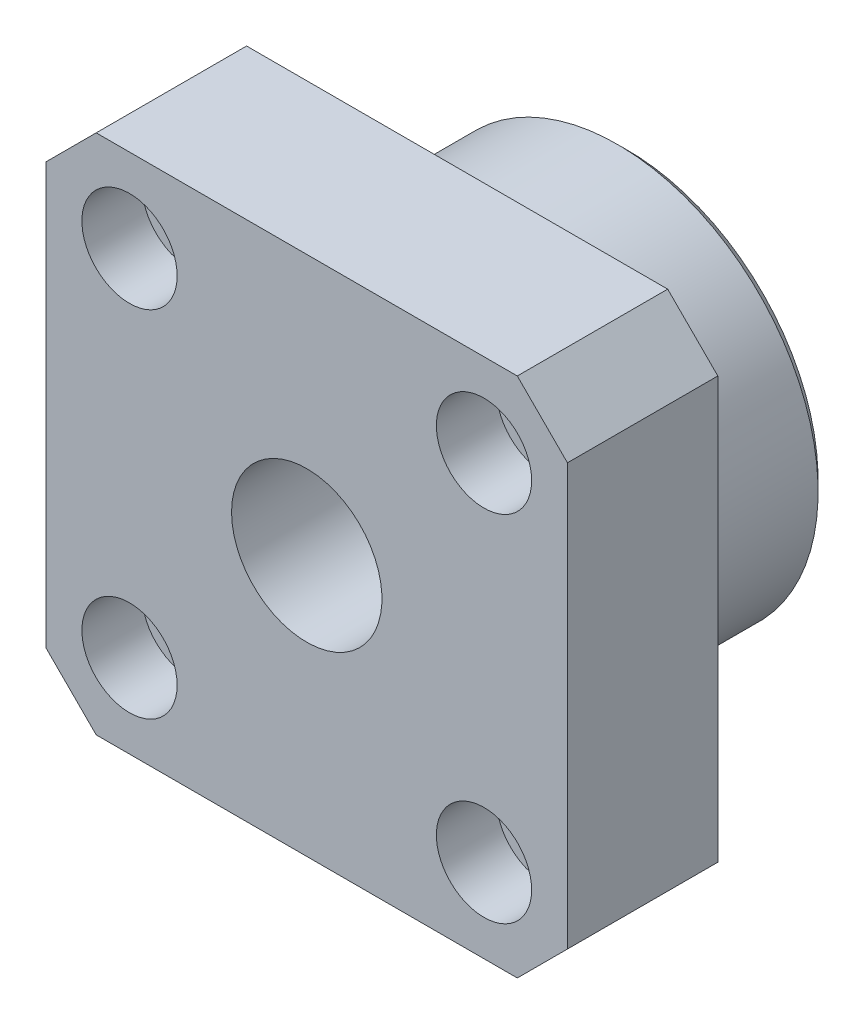
ISO-10303-21;
HEADER;
FILE_DESCRIPTION(('STEP AP214'),'2;1');
FILE_NAME('part.step','',(''),(''),'','','');
FILE_SCHEMA(('AUTOMOTIVE_DESIGN { 1 0 10303 214 1 1 1 1 }'));
ENDSEC;
DATA;
#1=APPLICATION_CONTEXT('core data for automotive mechanical design processes');
#2=APPLICATION_PROTOCOL_DEFINITION('international standard','automotive_design',2000,#1);
#3=PRODUCT_CONTEXT('',#1,'mechanical');
#4=PRODUCT('Part','Part','',(#3));
#5=PRODUCT_RELATED_PRODUCT_CATEGORY('part','',(#4));
#6=PRODUCT_DEFINITION_FORMATION('','',#4);
#7=PRODUCT_DEFINITION_CONTEXT('part definition',#1,'design');
#8=PRODUCT_DEFINITION('design','',#6,#7);
#9=PRODUCT_DEFINITION_SHAPE('','',#8);
#10=(LENGTH_UNIT() NAMED_UNIT(*) SI_UNIT(.MILLI.,.METRE.));
#11=(NAMED_UNIT(*) PLANE_ANGLE_UNIT() SI_UNIT($,.RADIAN.));
#12=(NAMED_UNIT(*) SI_UNIT($,.STERADIAN.) SOLID_ANGLE_UNIT());
#13=UNCERTAINTY_MEASURE_WITH_UNIT(LENGTH_MEASURE(1.E-05),#10,'distance_accuracy_value','');
#14=(GEOMETRIC_REPRESENTATION_CONTEXT(3) GLOBAL_UNCERTAINTY_ASSIGNED_CONTEXT((#13)) GLOBAL_UNIT_ASSIGNED_CONTEXT((#10,
#11,#12)) REPRESENTATION_CONTEXT('',''));
#15=CARTESIAN_POINT('',(0.,0.,0.));
#16=DIRECTION('',(0.,0.,1.));
#17=DIRECTION('',(1.,0.,0.));
#18=AXIS2_PLACEMENT_3D('',#15,#16,#17);
#19=CARTESIAN_POINT('',(0.,0.,0.));
#20=DIRECTION('',(0.,0.,-1.));
#21=DIRECTION('',(-1.,0.,0.));
#22=AXIS2_PLACEMENT_3D('',#19,#20,#21);
#23=PLANE('',#22);
#24=CARTESIAN_POINT('',(-17.6776695296639,-17.6776695296636,0.));
#25=DIRECTION('',(0.,0.,-1.));
#26=DIRECTION('',(-1.,0.,0.));
#27=AXIS2_PLACEMENT_3D('',#24,#25,#26);
#28=CIRCLE('',#27,2.75);
#29=CARTESIAN_POINT('',(-20.4276695296638,-17.6776695296636,0.));
#30=VERTEX_POINT('',#29);
#31=EDGE_CURVE('E134',#30,#30,#28,.T.);
#32=ORIENTED_EDGE('',*,*,#31,.F.);
#33=EDGE_LOOP('',(#32));
#34=FACE_BOUND('',#33,.T.);
#35=CARTESIAN_POINT('',(17.6776695296637,-17.6776695296636,0.));
#36=DIRECTION('',(0.,0.,-1.));
#37=DIRECTION('',(-1.,0.,0.));
#38=AXIS2_PLACEMENT_3D('',#35,#36,#37);
#39=CIRCLE('',#38,2.75);
#40=CARTESIAN_POINT('',(14.9276695296637,-17.6776695296636,0.));
#41=VERTEX_POINT('',#40);
#42=EDGE_CURVE('E129',#41,#41,#39,.T.);
#43=ORIENTED_EDGE('',*,*,#42,.F.);
#44=EDGE_LOOP('',(#43));
#45=FACE_BOUND('',#44,.T.);
#46=CARTESIAN_POINT('',(17.6776695296637,17.6776695296636,0.));
#47=DIRECTION('',(0.,0.,-1.));
#48=DIRECTION('',(-1.,0.,0.));
#49=AXIS2_PLACEMENT_3D('',#46,#47,#48);
#50=CIRCLE('',#49,2.75);
#51=CARTESIAN_POINT('',(14.9276695296637,17.6776695296636,0.));
#52=VERTEX_POINT('',#51);
#53=EDGE_CURVE('E124',#52,#52,#50,.T.);
#54=ORIENTED_EDGE('',*,*,#53,.F.);
#55=EDGE_LOOP('',(#54));
#56=FACE_BOUND('',#55,.T.);
#57=CARTESIAN_POINT('',(-17.6776695296637,17.6776695296636,0.));
#58=DIRECTION('',(0.,0.,-1.));
#59=DIRECTION('',(-1.,0.,0.));
#60=AXIS2_PLACEMENT_3D('',#57,#58,#59);
#61=CIRCLE('',#60,2.75);
#62=CARTESIAN_POINT('',(-20.4276695296637,17.6776695296636,0.));
#63=VERTEX_POINT('',#62);
#64=EDGE_CURVE('E119',#63,#63,#61,.T.);
#65=ORIENTED_EDGE('',*,*,#64,.F.);
#66=EDGE_LOOP('',(#65));
#67=FACE_BOUND('',#66,.T.);
#68=DIRECTION('',(1.,0.,0.));
#69=VECTOR('',#68,1.);
#70=CARTESIAN_POINT('',(-26.,-26.,0.));
#71=LINE('',#70,#69);
#72=CARTESIAN_POINT('',(-21.,-26.,0.));
#73=VERTEX_POINT('',#72);
#74=CARTESIAN_POINT('',(21.,-26.,0.));
#75=VERTEX_POINT('',#74);
#76=EDGE_CURVE('E101',#73,#75,#71,.T.);
#77=ORIENTED_EDGE('',*,*,#76,.F.);
#78=DIRECTION('',(0.707106781186546,-0.707106781186549,0.));
#79=VECTOR('',#78,1.);
#80=CARTESIAN_POINT('',(-23.5,-23.5,0.));
#81=LINE('',#80,#79);
#82=CARTESIAN_POINT('',(-26.,-21.,0.));
#83=VERTEX_POINT('',#82);
#84=EDGE_CURVE('E84',#73,#83,#81,.F.);
#85=ORIENTED_EDGE('',*,*,#84,.T.);
#86=DIRECTION('',(0.,-1.,0.));
#87=VECTOR('',#86,1.);
#88=CARTESIAN_POINT('',(-26.,-26.,0.));
#89=LINE('',#88,#87);
#90=CARTESIAN_POINT('',(-26.,21.,0.));
#91=VERTEX_POINT('',#90);
#92=EDGE_CURVE('E111',#91,#83,#89,.T.);
#93=ORIENTED_EDGE('',*,*,#92,.F.);
#94=DIRECTION('',(-0.707106781186549,-0.707106781186546,0.));
#95=VECTOR('',#94,1.);
#96=CARTESIAN_POINT('',(-23.5,23.5,0.));
#97=LINE('',#96,#95);
#98=CARTESIAN_POINT('',(-21.,26.,0.));
#99=VERTEX_POINT('',#98);
#100=EDGE_CURVE('E105',#91,#99,#97,.F.);
#101=ORIENTED_EDGE('',*,*,#100,.T.);
#102=DIRECTION('',(-1.,0.,0.));
#103=VECTOR('',#102,1.);
#104=CARTESIAN_POINT('',(-26.,26.,0.));
#105=LINE('',#104,#103);
#106=CARTESIAN_POINT('',(21.,26.,0.));
#107=VERTEX_POINT('',#106);
#108=EDGE_CURVE('E115',#107,#99,#105,.T.);
#109=ORIENTED_EDGE('',*,*,#108,.F.);
#110=DIRECTION('',(-0.707106781186547,0.707106781186549,0.));
#111=VECTOR('',#110,1.);
#112=CARTESIAN_POINT('',(23.5,23.5,0.));
#113=LINE('',#112,#111);
#114=CARTESIAN_POINT('',(26.,21.,0.));
#115=VERTEX_POINT('',#114);
#116=EDGE_CURVE('E141',#107,#115,#113,.F.);
#117=ORIENTED_EDGE('',*,*,#116,.T.);
#118=DIRECTION('',(0.,1.,0.));
#119=VECTOR('',#118,1.);
#120=CARTESIAN_POINT('',(26.,-26.,0.));
#121=LINE('',#120,#119);
#122=CARTESIAN_POINT('',(26.,-21.,0.));
#123=VERTEX_POINT('',#122);
#124=EDGE_CURVE('E217',#123,#115,#121,.T.);
#125=ORIENTED_EDGE('',*,*,#124,.F.);
#126=DIRECTION('',(0.707106781186549,0.707106781186546,0.));
#127=VECTOR('',#126,1.);
#128=CARTESIAN_POINT('',(23.5,-23.5,0.));
#129=LINE('',#128,#127);
#130=EDGE_CURVE('E95',#123,#75,#129,.F.);
#131=ORIENTED_EDGE('',*,*,#130,.T.);
#132=EDGE_LOOP('',(#77,#85,#93,#101,#109,#117,#125,#131));
#133=FACE_BOUND('',#132,.T.);
#134=CARTESIAN_POINT('',(0.,0.,0.));
#135=DIRECTION('',(0.,0.,-1.));
#136=DIRECTION('',(-1.,0.,0.));
#137=AXIS2_PLACEMENT_3D('',#134,#135,#136);
#138=CIRCLE('',#137,20.);
#139=CARTESIAN_POINT('',(-20.,0.,0.));
#140=VERTEX_POINT('',#139);
#141=EDGE_CURVE('E218',#140,#140,#138,.T.);
#142=ORIENTED_EDGE('',*,*,#141,.F.);
#143=EDGE_LOOP('',(#142));
#144=FACE_BOUND('',#143,.T.);
#145=ADVANCED_FACE('F17',(#34,#45,#56,#67,#133,#144),#23,.T.);
#146=CARTESIAN_POINT('',(26.,-26.,15.));
#147=DIRECTION('',(-1.,0.,0.));
#148=DIRECTION('',(0.,0.,1.));
#149=AXIS2_PLACEMENT_3D('',#146,#147,#148);
#150=PLANE('',#149);
#151=DIRECTION('',(0.,1.,0.));
#152=VECTOR('',#151,1.);
#153=CARTESIAN_POINT('',(26.,-26.,15.));
#154=LINE('',#153,#152);
#155=CARTESIAN_POINT('',(26.,-21.,15.));
#156=VERTEX_POINT('',#155);
#157=CARTESIAN_POINT('',(26.,21.,15.));
#158=VERTEX_POINT('',#157);
#159=EDGE_CURVE('E110',#156,#158,#154,.T.);
#160=ORIENTED_EDGE('',*,*,#159,.F.);
#161=DIRECTION('',(0.,0.,-1.));
#162=VECTOR('',#161,1.);
#163=CARTESIAN_POINT('',(26.,-21.,15.));
#164=LINE('',#163,#162);
#165=EDGE_CURVE('E156',#156,#123,#164,.T.);
#166=ORIENTED_EDGE('',*,*,#165,.T.);
#167=ORIENTED_EDGE('',*,*,#124,.T.);
#168=DIRECTION('',(0.,0.,1.));
#169=VECTOR('',#168,1.);
#170=CARTESIAN_POINT('',(26.,21.,15.));
#171=LINE('',#170,#169);
#172=EDGE_CURVE('E154',#115,#158,#171,.T.);
#173=ORIENTED_EDGE('',*,*,#172,.T.);
#174=EDGE_LOOP('',(#160,#166,#167,#173));
#175=FACE_BOUND('',#174,.T.);
#176=ADVANCED_FACE('F179',(#175),#150,.F.);
#177=CARTESIAN_POINT('',(-26.,26.,15.));
#178=DIRECTION('',(0.,-1.,0.));
#179=DIRECTION('',(0.,0.,-1.));
#180=AXIS2_PLACEMENT_3D('',#177,#178,#179);
#181=PLANE('',#180);
#182=DIRECTION('',(-1.,0.,0.));
#183=VECTOR('',#182,1.);
#184=CARTESIAN_POINT('',(-26.,26.,15.));
#185=LINE('',#184,#183);
#186=CARTESIAN_POINT('',(21.,26.,15.));
#187=VERTEX_POINT('',#186);
#188=CARTESIAN_POINT('',(-21.,26.,15.));
#189=VERTEX_POINT('',#188);
#190=EDGE_CURVE('E113',#187,#189,#185,.T.);
#191=ORIENTED_EDGE('',*,*,#190,.F.);
#192=DIRECTION('',(0.,0.,-1.));
#193=VECTOR('',#192,1.);
#194=CARTESIAN_POINT('',(21.,26.,15.));
#195=LINE('',#194,#193);
#196=EDGE_CURVE('E160',#187,#107,#195,.T.);
#197=ORIENTED_EDGE('',*,*,#196,.T.);
#198=ORIENTED_EDGE('',*,*,#108,.T.);
#199=DIRECTION('',(0.,0.,1.));
#200=VECTOR('',#199,1.);
#201=CARTESIAN_POINT('',(-21.,26.,15.));
#202=LINE('',#201,#200);
#203=EDGE_CURVE('E32',#99,#189,#202,.T.);
#204=ORIENTED_EDGE('',*,*,#203,.T.);
#205=EDGE_LOOP('',(#191,#197,#198,#204));
#206=FACE_BOUND('',#205,.T.);
#207=ADVANCED_FACE('F185',(#206),#181,.F.);
#208=CARTESIAN_POINT('',(-26.,-26.,15.));
#209=DIRECTION('',(1.,0.,0.));
#210=DIRECTION('',(0.,0.,-1.));
#211=AXIS2_PLACEMENT_3D('',#208,#209,#210);
#212=PLANE('',#211);
#213=ORIENTED_EDGE('',*,*,#92,.T.);
#214=DIRECTION('',(0.,0.,1.));
#215=VECTOR('',#214,1.);
#216=CARTESIAN_POINT('',(-26.,-21.,15.));
#217=LINE('',#216,#215);
#218=CARTESIAN_POINT('',(-26.,-21.,15.));
#219=VERTEX_POINT('',#218);
#220=EDGE_CURVE('E89',#83,#219,#217,.T.);
#221=ORIENTED_EDGE('',*,*,#220,.T.);
#222=DIRECTION('',(0.,-1.,0.));
#223=VECTOR('',#222,1.);
#224=CARTESIAN_POINT('',(-26.,-26.,15.));
#225=LINE('',#224,#223);
#226=CARTESIAN_POINT('',(-26.,21.,15.));
#227=VERTEX_POINT('',#226);
#228=EDGE_CURVE('E222',#227,#219,#225,.T.);
#229=ORIENTED_EDGE('',*,*,#228,.F.);
#230=DIRECTION('',(0.,0.,-1.));
#231=VECTOR('',#230,1.);
#232=CARTESIAN_POINT('',(-26.,21.,15.));
#233=LINE('',#232,#231);
#234=EDGE_CURVE('E94',#227,#91,#233,.T.);
#235=ORIENTED_EDGE('',*,*,#234,.T.);
#236=EDGE_LOOP('',(#213,#221,#229,#235));
#237=FACE_BOUND('',#236,.T.);
#238=ADVANCED_FACE('F196',(#237),#212,.F.);
#239=CARTESIAN_POINT('',(-26.,-26.,15.));
#240=DIRECTION('',(0.,1.,0.));
#241=DIRECTION('',(0.,0.,1.));
#242=AXIS2_PLACEMENT_3D('',#239,#240,#241);
#243=PLANE('',#242);
#244=DIRECTION('',(1.,0.,0.));
#245=VECTOR('',#244,1.);
#246=CARTESIAN_POINT('',(-26.,-26.,15.));
#247=LINE('',#246,#245);
#248=CARTESIAN_POINT('',(-21.,-26.,15.));
#249=VERTEX_POINT('',#248);
#250=CARTESIAN_POINT('',(21.,-26.,15.));
#251=VERTEX_POINT('',#250);
#252=EDGE_CURVE('E104',#249,#251,#247,.T.);
#253=ORIENTED_EDGE('',*,*,#252,.F.);
#254=DIRECTION('',(0.,0.,-1.));
#255=VECTOR('',#254,1.);
#256=CARTESIAN_POINT('',(-21.,-26.,15.));
#257=LINE('',#256,#255);
#258=EDGE_CURVE('E88',#249,#73,#257,.T.);
#259=ORIENTED_EDGE('',*,*,#258,.T.);
#260=ORIENTED_EDGE('',*,*,#76,.T.);
#261=DIRECTION('',(0.,0.,1.));
#262=VECTOR('',#261,1.);
#263=CARTESIAN_POINT('',(21.,-26.,15.));
#264=LINE('',#263,#262);
#265=EDGE_CURVE('E106',#75,#251,#264,.T.);
#266=ORIENTED_EDGE('',*,*,#265,.T.);
#267=EDGE_LOOP('',(#253,#259,#260,#266));
#268=FACE_BOUND('',#267,.T.);
#269=ADVANCED_FACE('F100',(#268),#243,.F.);
#270=CARTESIAN_POINT('',(0.,0.,15.));
#271=DIRECTION('',(0.,0.,-1.));
#272=DIRECTION('',(-1.,0.,0.));
#273=AXIS2_PLACEMENT_3D('',#270,#271,#272);
#274=PLANE('',#273);
#275=CARTESIAN_POINT('',(-17.6776695296639,-17.6776695296636,15.));
#276=DIRECTION('',(0.,0.,1.));
#277=DIRECTION('',(1.,0.,0.));
#278=AXIS2_PLACEMENT_3D('',#275,#276,#277);
#279=CIRCLE('',#278,4.75);
#280=CARTESIAN_POINT('',(-12.9276695296639,-17.6776695296636,15.));
#281=VERTEX_POINT('',#280);
#282=EDGE_CURVE('E259',#281,#281,#279,.T.);
#283=ORIENTED_EDGE('',*,*,#282,.F.);
#284=EDGE_LOOP('',(#283));
#285=FACE_BOUND('',#284,.T.);
#286=CARTESIAN_POINT('',(17.6776695296637,-17.6776695296636,15.));
#287=DIRECTION('',(0.,0.,1.));
#288=DIRECTION('',(1.,0.,0.));
#289=AXIS2_PLACEMENT_3D('',#286,#287,#288);
#290=CIRCLE('',#289,4.75);
#291=CARTESIAN_POINT('',(22.4276695296637,-17.6776695296636,15.));
#292=VERTEX_POINT('',#291);
#293=EDGE_CURVE('E137',#292,#292,#290,.T.);
#294=ORIENTED_EDGE('',*,*,#293,.F.);
#295=EDGE_LOOP('',(#294));
#296=FACE_BOUND('',#295,.T.);
#297=CARTESIAN_POINT('',(17.6776695296637,17.6776695296636,15.));
#298=DIRECTION('',(0.,0.,1.));
#299=DIRECTION('',(1.,0.,0.));
#300=AXIS2_PLACEMENT_3D('',#297,#298,#299);
#301=CIRCLE('',#300,4.75);
#302=CARTESIAN_POINT('',(22.4276695296637,17.6776695296636,15.));
#303=VERTEX_POINT('',#302);
#304=EDGE_CURVE('E132',#303,#303,#301,.T.);
#305=ORIENTED_EDGE('',*,*,#304,.F.);
#306=EDGE_LOOP('',(#305));
#307=FACE_BOUND('',#306,.T.);
#308=CARTESIAN_POINT('',(-17.6776695296637,17.6776695296636,15.));
#309=DIRECTION('',(0.,0.,1.));
#310=DIRECTION('',(1.,0.,0.));
#311=AXIS2_PLACEMENT_3D('',#308,#309,#310);
#312=CIRCLE('',#311,4.75);
#313=CARTESIAN_POINT('',(-12.9276695296637,17.6776695296636,15.));
#314=VERTEX_POINT('',#313);
#315=EDGE_CURVE('E127',#314,#314,#312,.T.);
#316=ORIENTED_EDGE('',*,*,#315,.F.);
#317=EDGE_LOOP('',(#316));
#318=FACE_BOUND('',#317,.T.);
#319=CARTESIAN_POINT('',(0.,0.,15.));
#320=DIRECTION('',(0.,0.,-1.));
#321=DIRECTION('',(-1.,0.,0.));
#322=AXIS2_PLACEMENT_3D('',#319,#320,#321);
#323=CIRCLE('',#322,7.5);
#324=CARTESIAN_POINT('',(-7.5,0.,15.));
#325=VERTEX_POINT('',#324);
#326=EDGE_CURVE('E228',#325,#325,#323,.T.);
#327=ORIENTED_EDGE('',*,*,#326,.T.);
#328=EDGE_LOOP('',(#327));
#329=FACE_BOUND('',#328,.T.);
#330=ORIENTED_EDGE('',*,*,#228,.T.);
#331=DIRECTION('',(-0.707106781186546,0.707106781186549,0.));
#332=VECTOR('',#331,1.);
#333=CARTESIAN_POINT('',(-21.,-26.,15.));
#334=LINE('',#333,#332);
#335=EDGE_CURVE('E152',#219,#249,#334,.F.);
#336=ORIENTED_EDGE('',*,*,#335,.T.);
#337=ORIENTED_EDGE('',*,*,#252,.T.);
#338=DIRECTION('',(-0.707106781186549,-0.707106781186546,0.));
#339=VECTOR('',#338,1.);
#340=CARTESIAN_POINT('',(26.,-21.,15.));
#341=LINE('',#340,#339);
#342=EDGE_CURVE('E150',#251,#156,#341,.F.);
#343=ORIENTED_EDGE('',*,*,#342,.T.);
#344=ORIENTED_EDGE('',*,*,#159,.T.);
#345=DIRECTION('',(0.707106781186547,-0.707106781186549,0.));
#346=VECTOR('',#345,1.);
#347=CARTESIAN_POINT('',(21.,26.,15.));
#348=LINE('',#347,#346);
#349=EDGE_CURVE('E39',#158,#187,#348,.F.);
#350=ORIENTED_EDGE('',*,*,#349,.T.);
#351=ORIENTED_EDGE('',*,*,#190,.T.);
#352=DIRECTION('',(0.707106781186549,0.707106781186546,0.));
#353=VECTOR('',#352,1.);
#354=CARTESIAN_POINT('',(-26.,21.,15.));
#355=LINE('',#354,#353);
#356=EDGE_CURVE('E147',#189,#227,#355,.F.);
#357=ORIENTED_EDGE('',*,*,#356,.T.);
#358=EDGE_LOOP('',(#330,#336,#337,#343,#344,#350,#351,#357));
#359=FACE_BOUND('',#358,.T.);
#360=ADVANCED_FACE('F192',(#285,#296,#307,#318,#329,#359),#274,.F.);
#361=CARTESIAN_POINT('',(0.,0.,-17.));
#362=DIRECTION('',(0.,0.,1.));
#363=DIRECTION('',(1.,0.,0.));
#364=AXIS2_PLACEMENT_3D('',#361,#362,#363);
#365=CYLINDRICAL_SURFACE('',#364,20.);
#366=CARTESIAN_POINT('',(0.,0.,-16.));
#367=DIRECTION('',(0.,0.,-1.));
#368=DIRECTION('',(-1.,0.,0.));
#369=AXIS2_PLACEMENT_3D('',#366,#367,#368);
#370=CIRCLE('',#369,20.);
#371=CARTESIAN_POINT('',(-20.,0.,-16.));
#372=VERTEX_POINT('',#371);
#373=EDGE_CURVE('E11',#372,#372,#370,.F.);
#374=ORIENTED_EDGE('',*,*,#373,.T.);
#375=EDGE_LOOP('',(#374));
#376=FACE_BOUND('',#375,.T.);
#377=ORIENTED_EDGE('',*,*,#141,.T.);
#378=EDGE_LOOP('',(#377));
#379=FACE_BOUND('',#378,.T.);
#380=ADVANCED_FACE('F266',(#376,#379),#365,.T.);
#381=CARTESIAN_POINT('',(0.,0.,-17.));
#382=DIRECTION('',(0.,0.,-1.));
#383=DIRECTION('',(-1.,0.,0.));
#384=AXIS2_PLACEMENT_3D('',#381,#382,#383);
#385=PLANE('',#384);
#386=CARTESIAN_POINT('',(0.,0.,-17.));
#387=DIRECTION('',(0.,0.,-1.));
#388=DIRECTION('',(-1.,0.,0.));
#389=AXIS2_PLACEMENT_3D('',#386,#387,#388);
#390=CIRCLE('',#389,19.);
#391=CARTESIAN_POINT('',(-19.,0.,-17.));
#392=VERTEX_POINT('',#391);
#393=EDGE_CURVE('E25',#392,#392,#390,.T.);
#394=ORIENTED_EDGE('',*,*,#393,.T.);
#395=EDGE_LOOP('',(#394));
#396=FACE_BOUND('',#395,.T.);
#397=CARTESIAN_POINT('',(0.,0.,-17.));
#398=DIRECTION('',(0.,0.,-1.));
#399=DIRECTION('',(-1.,0.,0.));
#400=AXIS2_PLACEMENT_3D('',#397,#398,#399);
#401=CIRCLE('',#400,7.5);
#402=CARTESIAN_POINT('',(-7.5,0.,-17.));
#403=VERTEX_POINT('',#402);
#404=EDGE_CURVE('E122',#403,#403,#401,.T.);
#405=ORIENTED_EDGE('',*,*,#404,.F.);
#406=EDGE_LOOP('',(#405));
#407=FACE_BOUND('',#406,.T.);
#408=ADVANCED_FACE('F165',(#396,#407),#385,.T.);
#409=CARTESIAN_POINT('',(0.,0.,15.));
#410=DIRECTION('',(0.,0.,-1.));
#411=DIRECTION('',(-1.,0.,0.));
#412=AXIS2_PLACEMENT_3D('',#409,#410,#411);
#413=CYLINDRICAL_SURFACE('',#412,7.5);
#414=ORIENTED_EDGE('',*,*,#326,.F.);
#415=EDGE_LOOP('',(#414));
#416=FACE_BOUND('',#415,.T.);
#417=ORIENTED_EDGE('',*,*,#404,.T.);
#418=EDGE_LOOP('',(#417));
#419=FACE_BOUND('',#418,.T.);
#420=ADVANCED_FACE('F281',(#416,#419),#413,.F.);
#421=CARTESIAN_POINT('',(-17.6776695296637,17.6776695296636,15.));
#422=DIRECTION('',(0.,0.,1.));
#423=DIRECTION('',(1.,0.,0.));
#424=AXIS2_PLACEMENT_3D('',#421,#422,#423);
#425=CYLINDRICAL_SURFACE('',#424,2.75);
#426=ORIENTED_EDGE('',*,*,#64,.T.);
#427=EDGE_LOOP('',(#426));
#428=FACE_BOUND('',#427,.T.);
#429=CARTESIAN_POINT('',(-17.6776695296637,17.6776695296636,9.));
#430=DIRECTION('',(0.,0.,1.));
#431=DIRECTION('',(1.,0.,0.));
#432=AXIS2_PLACEMENT_3D('',#429,#430,#431);
#433=CIRCLE('',#432,2.75);
#434=CARTESIAN_POINT('',(-14.9276695296637,17.6776695296636,9.));
#435=VERTEX_POINT('',#434);
#436=EDGE_CURVE('E123',#435,#435,#433,.T.);
#437=ORIENTED_EDGE('',*,*,#436,.T.);
#438=EDGE_LOOP('',(#437));
#439=FACE_BOUND('',#438,.T.);
#440=ADVANCED_FACE('F284',(#428,#439),#425,.F.);
#441=CARTESIAN_POINT('',(-14.9276695296637,17.6776695296636,9.));
#442=DIRECTION('',(0.,0.,-1.));
#443=DIRECTION('',(-1.,0.,0.));
#444=AXIS2_PLACEMENT_3D('',#441,#442,#443);
#445=PLANE('',#444);
#446=ORIENTED_EDGE('',*,*,#436,.F.);
#447=EDGE_LOOP('',(#446));
#448=FACE_BOUND('',#447,.T.);
#449=CARTESIAN_POINT('',(-17.6776695296637,17.6776695296636,9.));
#450=DIRECTION('',(0.,0.,1.));
#451=DIRECTION('',(1.,0.,0.));
#452=AXIS2_PLACEMENT_3D('',#449,#450,#451);
#453=CIRCLE('',#452,4.75);
#454=CARTESIAN_POINT('',(-12.9276695296637,17.6776695296636,9.));
#455=VERTEX_POINT('',#454);
#456=EDGE_CURVE('E235',#455,#455,#453,.T.);
#457=ORIENTED_EDGE('',*,*,#456,.T.);
#458=EDGE_LOOP('',(#457));
#459=FACE_BOUND('',#458,.T.);
#460=ADVANCED_FACE('F296',(#448,#459),#445,.F.);
#461=CARTESIAN_POINT('',(-17.6776695296637,17.6776695296636,15.));
#462=DIRECTION('',(0.,0.,1.));
#463=DIRECTION('',(1.,0.,0.));
#464=AXIS2_PLACEMENT_3D('',#461,#462,#463);
#465=CYLINDRICAL_SURFACE('',#464,4.75);
#466=ORIENTED_EDGE('',*,*,#456,.F.);
#467=EDGE_LOOP('',(#466));
#468=FACE_BOUND('',#467,.T.);
#469=ORIENTED_EDGE('',*,*,#315,.T.);
#470=EDGE_LOOP('',(#469));
#471=FACE_BOUND('',#470,.T.);
#472=ADVANCED_FACE('F300',(#468,#471),#465,.F.);
#473=CARTESIAN_POINT('',(17.6776695296637,17.6776695296636,15.));
#474=DIRECTION('',(0.,0.,1.));
#475=DIRECTION('',(1.,0.,0.));
#476=AXIS2_PLACEMENT_3D('',#473,#474,#475);
#477=CYLINDRICAL_SURFACE('',#476,2.75);
#478=ORIENTED_EDGE('',*,*,#53,.T.);
#479=EDGE_LOOP('',(#478));
#480=FACE_BOUND('',#479,.T.);
#481=CARTESIAN_POINT('',(17.6776695296637,17.6776695296636,9.));
#482=DIRECTION('',(0.,0.,1.));
#483=DIRECTION('',(1.,0.,0.));
#484=AXIS2_PLACEMENT_3D('',#481,#482,#483);
#485=CIRCLE('',#484,2.75);
#486=CARTESIAN_POINT('',(20.4276695296637,17.6776695296636,9.));
#487=VERTEX_POINT('',#486);
#488=EDGE_CURVE('E128',#487,#487,#485,.T.);
#489=ORIENTED_EDGE('',*,*,#488,.T.);
#490=EDGE_LOOP('',(#489));
#491=FACE_BOUND('',#490,.T.);
#492=ADVANCED_FACE('F304',(#480,#491),#477,.F.);
#493=CARTESIAN_POINT('',(20.4276695296637,17.6776695296636,9.));
#494=DIRECTION('',(0.,0.,-1.));
#495=DIRECTION('',(-1.,0.,0.));
#496=AXIS2_PLACEMENT_3D('',#493,#494,#495);
#497=PLANE('',#496);
#498=ORIENTED_EDGE('',*,*,#488,.F.);
#499=EDGE_LOOP('',(#498));
#500=FACE_BOUND('',#499,.T.);
#501=CARTESIAN_POINT('',(17.6776695296637,17.6776695296636,9.));
#502=DIRECTION('',(0.,0.,1.));
#503=DIRECTION('',(1.,0.,0.));
#504=AXIS2_PLACEMENT_3D('',#501,#502,#503);
#505=CIRCLE('',#504,4.75);
#506=CARTESIAN_POINT('',(22.4276695296637,17.6776695296636,9.));
#507=VERTEX_POINT('',#506);
#508=EDGE_CURVE('E242',#507,#507,#505,.T.);
#509=ORIENTED_EDGE('',*,*,#508,.T.);
#510=EDGE_LOOP('',(#509));
#511=FACE_BOUND('',#510,.T.);
#512=ADVANCED_FACE('F308',(#500,#511),#497,.F.);
#513=CARTESIAN_POINT('',(17.6776695296637,17.6776695296636,15.));
#514=DIRECTION('',(0.,0.,1.));
#515=DIRECTION('',(1.,0.,0.));
#516=AXIS2_PLACEMENT_3D('',#513,#514,#515);
#517=CYLINDRICAL_SURFACE('',#516,4.75);
#518=ORIENTED_EDGE('',*,*,#508,.F.);
#519=EDGE_LOOP('',(#518));
#520=FACE_BOUND('',#519,.T.);
#521=ORIENTED_EDGE('',*,*,#304,.T.);
#522=EDGE_LOOP('',(#521));
#523=FACE_BOUND('',#522,.T.);
#524=ADVANCED_FACE('F312',(#520,#523),#517,.F.);
#525=CARTESIAN_POINT('',(17.6776695296637,-17.6776695296636,15.));
#526=DIRECTION('',(0.,0.,1.));
#527=DIRECTION('',(1.,0.,0.));
#528=AXIS2_PLACEMENT_3D('',#525,#526,#527);
#529=CYLINDRICAL_SURFACE('',#528,2.75);
#530=ORIENTED_EDGE('',*,*,#42,.T.);
#531=EDGE_LOOP('',(#530));
#532=FACE_BOUND('',#531,.T.);
#533=CARTESIAN_POINT('',(17.6776695296637,-17.6776695296636,9.));
#534=DIRECTION('',(0.,0.,1.));
#535=DIRECTION('',(1.,0.,0.));
#536=AXIS2_PLACEMENT_3D('',#533,#534,#535);
#537=CIRCLE('',#536,2.75);
#538=CARTESIAN_POINT('',(20.4276695296637,-17.6776695296636,9.));
#539=VERTEX_POINT('',#538);
#540=EDGE_CURVE('E133',#539,#539,#537,.T.);
#541=ORIENTED_EDGE('',*,*,#540,.T.);
#542=EDGE_LOOP('',(#541));
#543=FACE_BOUND('',#542,.T.);
#544=ADVANCED_FACE('F316',(#532,#543),#529,.F.);
#545=CARTESIAN_POINT('',(20.4276695296637,-17.6776695296636,9.));
#546=DIRECTION('',(0.,0.,-1.));
#547=DIRECTION('',(-1.,0.,0.));
#548=AXIS2_PLACEMENT_3D('',#545,#546,#547);
#549=PLANE('',#548);
#550=ORIENTED_EDGE('',*,*,#540,.F.);
#551=EDGE_LOOP('',(#550));
#552=FACE_BOUND('',#551,.T.);
#553=CARTESIAN_POINT('',(17.6776695296637,-17.6776695296636,9.));
#554=DIRECTION('',(0.,0.,1.));
#555=DIRECTION('',(1.,0.,0.));
#556=AXIS2_PLACEMENT_3D('',#553,#554,#555);
#557=CIRCLE('',#556,4.75);
#558=CARTESIAN_POINT('',(22.4276695296637,-17.6776695296636,9.));
#559=VERTEX_POINT('',#558);
#560=EDGE_CURVE('E249',#559,#559,#557,.T.);
#561=ORIENTED_EDGE('',*,*,#560,.T.);
#562=EDGE_LOOP('',(#561));
#563=FACE_BOUND('',#562,.T.);
#564=ADVANCED_FACE('F320',(#552,#563),#549,.F.);
#565=CARTESIAN_POINT('',(17.6776695296637,-17.6776695296636,15.));
#566=DIRECTION('',(0.,0.,1.));
#567=DIRECTION('',(1.,0.,0.));
#568=AXIS2_PLACEMENT_3D('',#565,#566,#567);
#569=CYLINDRICAL_SURFACE('',#568,4.75);
#570=ORIENTED_EDGE('',*,*,#560,.F.);
#571=EDGE_LOOP('',(#570));
#572=FACE_BOUND('',#571,.T.);
#573=ORIENTED_EDGE('',*,*,#293,.T.);
#574=EDGE_LOOP('',(#573));
#575=FACE_BOUND('',#574,.T.);
#576=ADVANCED_FACE('F324',(#572,#575),#569,.F.);
#577=CARTESIAN_POINT('',(-17.6776695296639,-17.6776695296636,15.));
#578=DIRECTION('',(0.,0.,1.));
#579=DIRECTION('',(1.,0.,0.));
#580=AXIS2_PLACEMENT_3D('',#577,#578,#579);
#581=CYLINDRICAL_SURFACE('',#580,2.75);
#582=ORIENTED_EDGE('',*,*,#31,.T.);
#583=EDGE_LOOP('',(#582));
#584=FACE_BOUND('',#583,.T.);
#585=CARTESIAN_POINT('',(-17.6776695296639,-17.6776695296636,9.));
#586=DIRECTION('',(0.,0.,1.));
#587=DIRECTION('',(1.,0.,0.));
#588=AXIS2_PLACEMENT_3D('',#585,#586,#587);
#589=CIRCLE('',#588,2.75);
#590=CARTESIAN_POINT('',(-14.9276695296639,-17.6776695296636,9.));
#591=VERTEX_POINT('',#590);
#592=EDGE_CURVE('E138',#591,#591,#589,.T.);
#593=ORIENTED_EDGE('',*,*,#592,.T.);
#594=EDGE_LOOP('',(#593));
#595=FACE_BOUND('',#594,.T.);
#596=ADVANCED_FACE('F328',(#584,#595),#581,.F.);
#597=CARTESIAN_POINT('',(-14.9276695296638,-17.6776695296636,9.));
#598=DIRECTION('',(0.,0.,-1.));
#599=DIRECTION('',(-1.,0.,0.));
#600=AXIS2_PLACEMENT_3D('',#597,#598,#599);
#601=PLANE('',#600);
#602=ORIENTED_EDGE('',*,*,#592,.F.);
#603=EDGE_LOOP('',(#602));
#604=FACE_BOUND('',#603,.T.);
#605=CARTESIAN_POINT('',(-17.6776695296639,-17.6776695296636,9.));
#606=DIRECTION('',(0.,0.,1.));
#607=DIRECTION('',(1.,0.,0.));
#608=AXIS2_PLACEMENT_3D('',#605,#606,#607);
#609=CIRCLE('',#608,4.75);
#610=CARTESIAN_POINT('',(-12.9276695296639,-17.6776695296636,9.));
#611=VERTEX_POINT('',#610);
#612=EDGE_CURVE('E256',#611,#611,#609,.T.);
#613=ORIENTED_EDGE('',*,*,#612,.T.);
#614=EDGE_LOOP('',(#613));
#615=FACE_BOUND('',#614,.T.);
#616=ADVANCED_FACE('F332',(#604,#615),#601,.F.);
#617=CARTESIAN_POINT('',(-17.6776695296639,-17.6776695296636,15.));
#618=DIRECTION('',(0.,0.,1.));
#619=DIRECTION('',(1.,0.,0.));
#620=AXIS2_PLACEMENT_3D('',#617,#618,#619);
#621=CYLINDRICAL_SURFACE('',#620,4.75);
#622=ORIENTED_EDGE('',*,*,#612,.F.);
#623=EDGE_LOOP('',(#622));
#624=FACE_BOUND('',#623,.T.);
#625=ORIENTED_EDGE('',*,*,#282,.T.);
#626=EDGE_LOOP('',(#625));
#627=FACE_BOUND('',#626,.T.);
#628=ADVANCED_FACE('F205',(#624,#627),#621,.F.);
#629=CARTESIAN_POINT('',(-21.,-26.,15.));
#630=DIRECTION('',(0.707106781186549,0.707106781186546,0.));
#631=DIRECTION('',(0.,0.,-1.));
#632=AXIS2_PLACEMENT_3D('',#629,#630,#631);
#633=PLANE('',#632);
#634=ORIENTED_EDGE('',*,*,#335,.F.);
#635=ORIENTED_EDGE('',*,*,#220,.F.);
#636=ORIENTED_EDGE('',*,*,#84,.F.);
#637=ORIENTED_EDGE('',*,*,#258,.F.);
#638=EDGE_LOOP('',(#634,#635,#636,#637));
#639=FACE_BOUND('',#638,.T.);
#640=ADVANCED_FACE('F87',(#639),#633,.F.);
#641=CARTESIAN_POINT('',(26.,-21.,15.));
#642=DIRECTION('',(-0.707106781186546,0.707106781186549,0.));
#643=DIRECTION('',(0.,0.,-1.));
#644=AXIS2_PLACEMENT_3D('',#641,#642,#643);
#645=PLANE('',#644);
#646=ORIENTED_EDGE('',*,*,#342,.F.);
#647=ORIENTED_EDGE('',*,*,#265,.F.);
#648=ORIENTED_EDGE('',*,*,#130,.F.);
#649=ORIENTED_EDGE('',*,*,#165,.F.);
#650=EDGE_LOOP('',(#646,#647,#648,#649));
#651=FACE_BOUND('',#650,.T.);
#652=ADVANCED_FACE('F204',(#651),#645,.F.);
#653=CARTESIAN_POINT('',(21.,26.,15.));
#654=DIRECTION('',(-0.707106781186549,-0.707106781186547,0.));
#655=DIRECTION('',(0.,0.,-1.));
#656=AXIS2_PLACEMENT_3D('',#653,#654,#655);
#657=PLANE('',#656);
#658=ORIENTED_EDGE('',*,*,#349,.F.);
#659=ORIENTED_EDGE('',*,*,#172,.F.);
#660=ORIENTED_EDGE('',*,*,#116,.F.);
#661=ORIENTED_EDGE('',*,*,#196,.F.);
#662=EDGE_LOOP('',(#658,#659,#660,#661));
#663=FACE_BOUND('',#662,.T.);
#664=ADVANCED_FACE('F175',(#663),#657,.F.);
#665=CARTESIAN_POINT('',(-26.,21.,15.));
#666=DIRECTION('',(0.707106781186546,-0.707106781186549,0.));
#667=DIRECTION('',(0.,0.,-1.));
#668=AXIS2_PLACEMENT_3D('',#665,#666,#667);
#669=PLANE('',#668);
#670=ORIENTED_EDGE('',*,*,#356,.F.);
#671=ORIENTED_EDGE('',*,*,#203,.F.);
#672=ORIENTED_EDGE('',*,*,#100,.F.);
#673=ORIENTED_EDGE('',*,*,#234,.F.);
#674=EDGE_LOOP('',(#670,#671,#672,#673));
#675=FACE_BOUND('',#674,.T.);
#676=ADVANCED_FACE('F169',(#675),#669,.F.);
#677=CARTESIAN_POINT('',(0.,0.,-17.));
#678=DIRECTION('',(0.,0.,1.));
#679=DIRECTION('',(1.,0.,0.));
#680=AXIS2_PLACEMENT_3D('',#677,#678,#679);
#681=CONICAL_SURFACE('',#680,19.,0.785398163397445);
#682=ORIENTED_EDGE('',*,*,#373,.F.);
#683=EDGE_LOOP('',(#682));
#684=FACE_BOUND('',#683,.T.);
#685=ORIENTED_EDGE('',*,*,#393,.F.);
#686=EDGE_LOOP('',(#685));
#687=FACE_BOUND('',#686,.T.);
#688=ADVANCED_FACE('F19',(#684,#687),#681,.T.);
#689=CLOSED_SHELL('',(#145,#176,#207,#238,#269,#360,#380,#408,#420,#440,#460,#472,#492,#512,
#524,#544,#564,#576,#596,#616,#628,#640,#652,#664,#676,#688));
#690=MANIFOLD_SOLID_BREP('B1',#689);
#691=ADVANCED_BREP_SHAPE_REPRESENTATION('',(#18,#690),#14);
#692=SHAPE_DEFINITION_REPRESENTATION(#9,#691);
ENDSEC;
END-ISO-10303-21;
